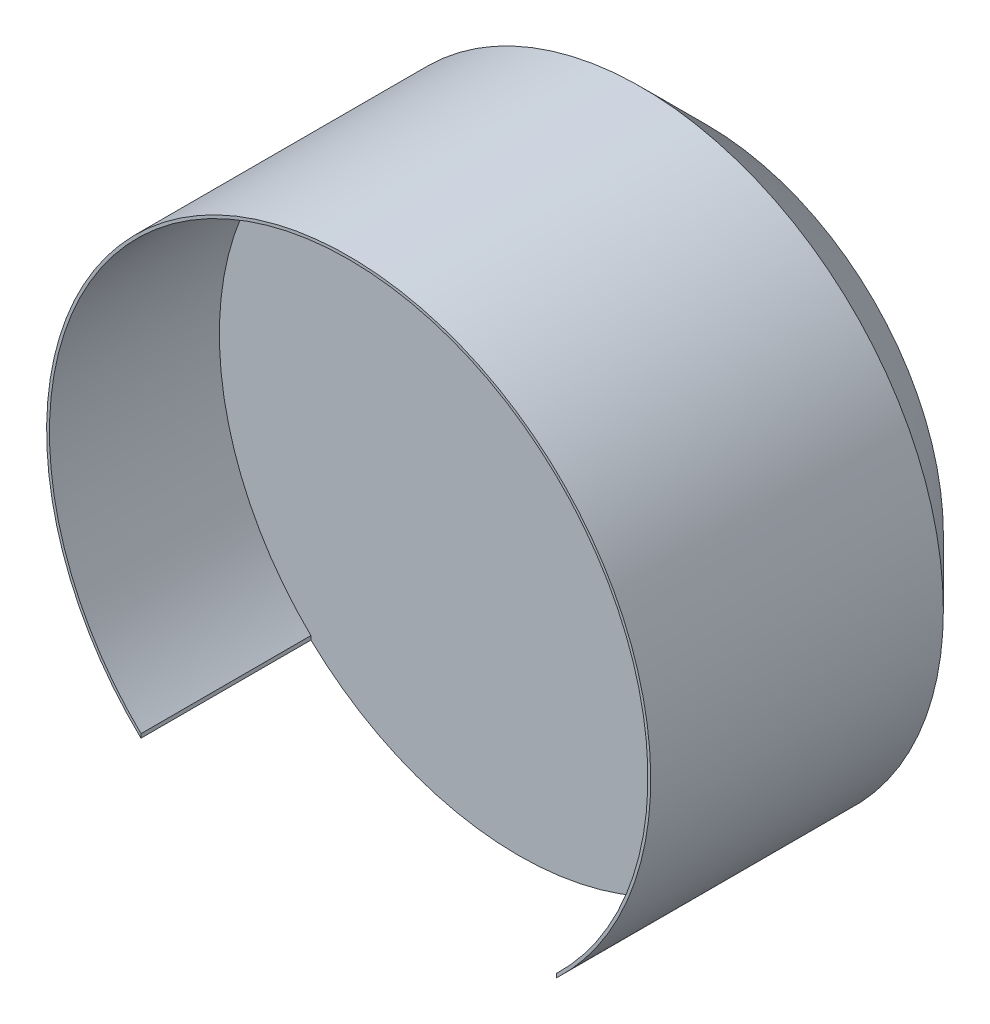
ISO-10303-21;
HEADER;
FILE_DESCRIPTION(('STEP AP214'),'2;1');
FILE_NAME('part.step','',(''),(''),'','','');
FILE_SCHEMA(('AUTOMOTIVE_DESIGN { 1 0 10303 214 1 1 1 1 }'));
ENDSEC;
DATA;
#1=APPLICATION_CONTEXT('core data for automotive mechanical design processes');
#2=APPLICATION_PROTOCOL_DEFINITION('international standard','automotive_design',2000,#1);
#3=PRODUCT_CONTEXT('',#1,'mechanical');
#4=PRODUCT('Part','Part','',(#3));
#5=PRODUCT_RELATED_PRODUCT_CATEGORY('part','',(#4));
#6=PRODUCT_DEFINITION_FORMATION('','',#4);
#7=PRODUCT_DEFINITION_CONTEXT('part definition',#1,'design');
#8=PRODUCT_DEFINITION('design','',#6,#7);
#9=PRODUCT_DEFINITION_SHAPE('','',#8);
#10=(LENGTH_UNIT() NAMED_UNIT(*) SI_UNIT(.MILLI.,.METRE.));
#11=(NAMED_UNIT(*) PLANE_ANGLE_UNIT() SI_UNIT($,.RADIAN.));
#12=(NAMED_UNIT(*) SI_UNIT($,.STERADIAN.) SOLID_ANGLE_UNIT());
#13=UNCERTAINTY_MEASURE_WITH_UNIT(LENGTH_MEASURE(1.E-05),#10,'distance_accuracy_value','');
#14=(GEOMETRIC_REPRESENTATION_CONTEXT(3) GLOBAL_UNCERTAINTY_ASSIGNED_CONTEXT((#13)) GLOBAL_UNIT_ASSIGNED_CONTEXT((#10,
#11,#12)) REPRESENTATION_CONTEXT('',''));
#15=CARTESIAN_POINT('',(0.,0.,0.));
#16=DIRECTION('',(0.,0.,1.));
#17=DIRECTION('',(1.,0.,0.));
#18=AXIS2_PLACEMENT_3D('',#15,#16,#17);
#19=CARTESIAN_POINT('',(0.,0.,200.));
#20=DIRECTION('',(0.,0.,-1.));
#21=DIRECTION('',(-1.,0.,0.));
#22=AXIS2_PLACEMENT_3D('',#19,#20,#21);
#23=CYLINDRICAL_SURFACE('',#22,320.);
#24=CARTESIAN_POINT('',(0.,0.,70.0000000000001));
#25=DIRECTION('',(0.,0.,1.));
#26=DIRECTION('',(1.,0.,0.));
#27=AXIS2_PLACEMENT_3D('',#24,#25,#26);
#28=CIRCLE('',#27,320.);
#29=CARTESIAN_POINT('',(320.,0.,70.0000000000001));
#30=VERTEX_POINT('',#29);
#31=EDGE_CURVE('E103',#30,#30,#28,.T.);
#32=ORIENTED_EDGE('',*,*,#31,.T.);
#33=EDGE_LOOP('',(#32));
#34=FACE_BOUND('',#33,.T.);
#35=CARTESIAN_POINT('',(0.,0.,380.));
#36=DIRECTION('',(0.,0.,1.));
#37=DIRECTION('',(1.,0.,0.));
#38=AXIS2_PLACEMENT_3D('',#35,#36,#37);
#39=CIRCLE('',#38,320.);
#40=CARTESIAN_POINT('',(220.,-232.379000772445,380.));
#41=VERTEX_POINT('',#40);
#42=CARTESIAN_POINT('',(-220.,-232.379000772445,380.));
#43=VERTEX_POINT('',#42);
#44=EDGE_CURVE('E101',#41,#43,#39,.T.);
#45=ORIENTED_EDGE('',*,*,#44,.F.);
#46=DIRECTION('',(0.,0.,-1.));
#47=VECTOR('',#46,1.);
#48=CARTESIAN_POINT('',(220.,-232.379000772445,200.));
#49=LINE('',#48,#47);
#50=CARTESIAN_POINT('',(220.,-232.379000772445,200.));
#51=VERTEX_POINT('',#50);
#52=EDGE_CURVE('E77',#41,#51,#49,.T.);
#53=ORIENTED_EDGE('',*,*,#52,.T.);
#54=CARTESIAN_POINT('',(0.,0.,200.));
#55=DIRECTION('',(0.,0.,-1.));
#56=DIRECTION('',(-1.,0.,0.));
#57=AXIS2_PLACEMENT_3D('',#54,#55,#56);
#58=CIRCLE('',#57,320.);
#59=CARTESIAN_POINT('',(-220.,-232.379000772445,200.));
#60=VERTEX_POINT('',#59);
#61=EDGE_CURVE('E53',#51,#60,#58,.T.);
#62=ORIENTED_EDGE('',*,*,#61,.T.);
#63=DIRECTION('',(0.,0.,-1.));
#64=VECTOR('',#63,1.);
#65=CARTESIAN_POINT('',(-220.,-232.379000772445,200.));
#66=LINE('',#65,#64);
#67=EDGE_CURVE('E75',#60,#43,#66,.F.);
#68=ORIENTED_EDGE('',*,*,#67,.T.);
#69=EDGE_LOOP('',(#45,#53,#62,#68));
#70=FACE_BOUND('',#69,.T.);
#71=ADVANCED_FACE('F33',(#34,#70),#23,.T.);
#72=CARTESIAN_POINT('',(0.,0.,0.));
#73=DIRECTION('',(0.,0.,1.));
#74=DIRECTION('',(1.,0.,0.));
#75=AXIS2_PLACEMENT_3D('',#72,#73,#74);
#76=PLANE('',#75);
#77=CARTESIAN_POINT('',(0.,0.,0.));
#78=DIRECTION('',(0.,0.,1.));
#79=DIRECTION('',(1.,0.,0.));
#80=AXIS2_PLACEMENT_3D('',#77,#78,#79);
#81=CIRCLE('',#80,250.);
#82=CARTESIAN_POINT('',(250.,0.,0.));
#83=VERTEX_POINT('',#82);
#84=EDGE_CURVE('E41',#83,#83,#81,.F.);
#85=ORIENTED_EDGE('',*,*,#84,.T.);
#86=EDGE_LOOP('',(#85));
#87=FACE_BOUND('',#86,.T.);
#88=ADVANCED_FACE('F108',(#87),#76,.F.);
#89=CARTESIAN_POINT('',(0.,0.,70.0000000000001));
#90=DIRECTION('',(0.,0.,1.));
#91=DIRECTION('',(1.,0.,0.));
#92=AXIS2_PLACEMENT_3D('',#89,#90,#91);
#93=CONICAL_SURFACE('',#92,320.,0.78539816339745);
#94=ORIENTED_EDGE('',*,*,#84,.F.);
#95=EDGE_LOOP('',(#94));
#96=FACE_BOUND('',#95,.T.);
#97=ORIENTED_EDGE('',*,*,#31,.F.);
#98=EDGE_LOOP('',(#97));
#99=FACE_BOUND('',#98,.T.);
#100=ADVANCED_FACE('F35',(#96,#99),#93,.T.);
#101=CARTESIAN_POINT('',(0.,0.,380.));
#102=DIRECTION('',(0.,0.,1.));
#103=DIRECTION('',(1.,0.,0.));
#104=AXIS2_PLACEMENT_3D('',#101,#102,#103);
#105=PLANE('',#104);
#106=DIRECTION('',(0.,1.,0.));
#107=VECTOR('',#106,1.);
#108=CARTESIAN_POINT('',(220.,-320.,380.));
#109=LINE('',#108,#107);
#110=CARTESIAN_POINT('',(220.,-228.230147000785,380.));
#111=VERTEX_POINT('',#110);
#112=EDGE_CURVE('E91',#41,#111,#109,.T.);
#113=ORIENTED_EDGE('',*,*,#112,.F.);
#114=ORIENTED_EDGE('',*,*,#44,.T.);
#115=DIRECTION('',(0.,1.,0.));
#116=VECTOR('',#115,1.);
#117=CARTESIAN_POINT('',(-220.,-320.,380.));
#118=LINE('',#117,#116);
#119=CARTESIAN_POINT('',(-220.,-228.230147000785,380.));
#120=VERTEX_POINT('',#119);
#121=EDGE_CURVE('E85',#43,#120,#118,.T.);
#122=ORIENTED_EDGE('',*,*,#121,.T.);
#123=CARTESIAN_POINT('',(0.,0.,380.));
#124=DIRECTION('',(0.,0.,1.));
#125=DIRECTION('',(1.,0.,0.));
#126=AXIS2_PLACEMENT_3D('',#123,#124,#125);
#127=CIRCLE('',#126,317.);
#128=EDGE_CURVE('E78',#111,#120,#127,.T.);
#129=ORIENTED_EDGE('',*,*,#128,.F.);
#130=EDGE_LOOP('',(#113,#114,#122,#129));
#131=FACE_BOUND('',#130,.T.);
#132=ADVANCED_FACE('F112',(#131),#105,.T.);
#133=CARTESIAN_POINT('',(0.,0.,380.));
#134=DIRECTION('',(0.,0.,-1.));
#135=DIRECTION('',(-1.,0.,0.));
#136=AXIS2_PLACEMENT_3D('',#133,#134,#135);
#137=CYLINDRICAL_SURFACE('',#136,317.);
#138=DIRECTION('',(0.,0.,-1.));
#139=VECTOR('',#138,1.);
#140=CARTESIAN_POINT('',(220.,-228.230147000785,380.));
#141=LINE('',#140,#139);
#142=CARTESIAN_POINT('',(220.,-228.230147000785,200.));
#143=VERTEX_POINT('',#142);
#144=EDGE_CURVE('E86',#111,#143,#141,.T.);
#145=ORIENTED_EDGE('',*,*,#144,.F.);
#146=ORIENTED_EDGE('',*,*,#128,.T.);
#147=DIRECTION('',(0.,0.,-1.));
#148=VECTOR('',#147,1.);
#149=CARTESIAN_POINT('',(-220.,-228.230147000785,380.));
#150=LINE('',#149,#148);
#151=CARTESIAN_POINT('',(-220.,-228.230147000785,200.));
#152=VERTEX_POINT('',#151);
#153=EDGE_CURVE('E87',#152,#120,#150,.F.);
#154=ORIENTED_EDGE('',*,*,#153,.F.);
#155=CARTESIAN_POINT('',(0.,0.,200.));
#156=DIRECTION('',(0.,0.,1.));
#157=DIRECTION('',(1.,0.,0.));
#158=AXIS2_PLACEMENT_3D('',#155,#156,#157);
#159=CIRCLE('',#158,317.);
#160=EDGE_CURVE('E11',#152,#143,#159,.F.);
#161=ORIENTED_EDGE('',*,*,#160,.T.);
#162=EDGE_LOOP('',(#145,#146,#154,#161));
#163=FACE_BOUND('',#162,.T.);
#164=ADVANCED_FACE('F124',(#163),#137,.F.);
#165=CARTESIAN_POINT('',(0.,0.,200.));
#166=DIRECTION('',(0.,0.,1.));
#167=DIRECTION('',(1.,0.,0.));
#168=AXIS2_PLACEMENT_3D('',#165,#166,#167);
#169=PLANE('',#168);
#170=ORIENTED_EDGE('',*,*,#160,.F.);
#171=DIRECTION('',(0.,1.,0.));
#172=VECTOR('',#171,1.);
#173=CARTESIAN_POINT('',(-220.,-320.,200.));
#174=LINE('',#173,#172);
#175=EDGE_CURVE('E82',#60,#152,#174,.T.);
#176=ORIENTED_EDGE('',*,*,#175,.F.);
#177=ORIENTED_EDGE('',*,*,#61,.F.);
#178=DIRECTION('',(0.,1.,0.));
#179=VECTOR('',#178,1.);
#180=CARTESIAN_POINT('',(220.,-320.,200.));
#181=LINE('',#180,#179);
#182=EDGE_CURVE('E48',#51,#143,#181,.T.);
#183=ORIENTED_EDGE('',*,*,#182,.T.);
#184=EDGE_LOOP('',(#170,#176,#177,#183));
#185=FACE_BOUND('',#184,.T.);
#186=ADVANCED_FACE('F89',(#185),#169,.T.);
#187=CARTESIAN_POINT('',(220.,-320.,200.));
#188=DIRECTION('',(1.,0.,0.));
#189=DIRECTION('',(0.,0.,-1.));
#190=AXIS2_PLACEMENT_3D('',#187,#188,#189);
#191=PLANE('',#190);
#192=ORIENTED_EDGE('',*,*,#112,.T.);
#193=ORIENTED_EDGE('',*,*,#144,.T.);
#194=ORIENTED_EDGE('',*,*,#182,.F.);
#195=ORIENTED_EDGE('',*,*,#52,.F.);
#196=EDGE_LOOP('',(#192,#193,#194,#195));
#197=FACE_BOUND('',#196,.T.);
#198=ADVANCED_FACE('F123',(#197),#191,.F.);
#199=CARTESIAN_POINT('',(-220.,-320.,200.));
#200=DIRECTION('',(-1.,0.,0.));
#201=DIRECTION('',(0.,0.,1.));
#202=AXIS2_PLACEMENT_3D('',#199,#200,#201);
#203=PLANE('',#202);
#204=ORIENTED_EDGE('',*,*,#175,.T.);
#205=ORIENTED_EDGE('',*,*,#153,.T.);
#206=ORIENTED_EDGE('',*,*,#121,.F.);
#207=ORIENTED_EDGE('',*,*,#67,.F.);
#208=EDGE_LOOP('',(#204,#205,#206,#207));
#209=FACE_BOUND('',#208,.T.);
#210=ADVANCED_FACE('F81',(#209),#203,.F.);
#211=CLOSED_SHELL('',(#71,#88,#100,#132,#164,#186,#198,#210));
#212=MANIFOLD_SOLID_BREP('B2',#211);
#213=ADVANCED_BREP_SHAPE_REPRESENTATION('',(#18,#212),#14);
#214=SHAPE_DEFINITION_REPRESENTATION(#9,#213);
ENDSEC;
END-ISO-10303-21;
